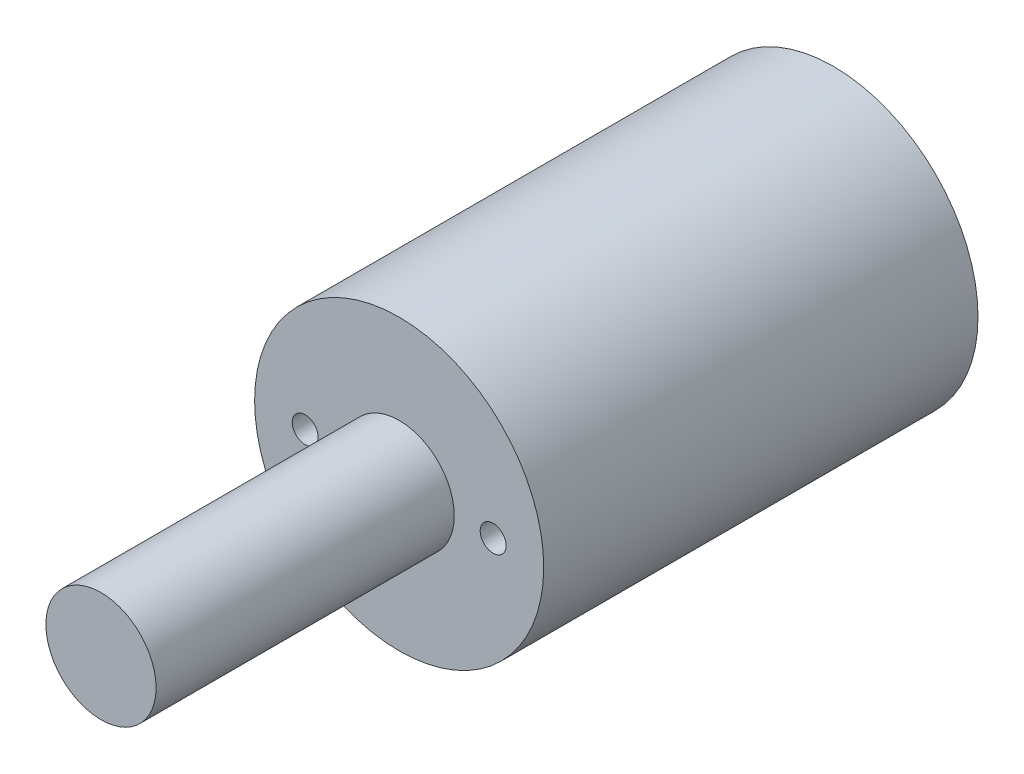
ISO-10303-21;
HEADER;
FILE_DESCRIPTION(('STEP AP214'),'2;1');
FILE_NAME('part.step','',(''),(''),'','','');
FILE_SCHEMA(('AUTOMOTIVE_DESIGN { 1 0 10303 214 1 1 1 1 }'));
ENDSEC;
DATA;
#1=APPLICATION_CONTEXT('core data for automotive mechanical design processes');
#2=APPLICATION_PROTOCOL_DEFINITION('international standard','automotive_design',2000,#1);
#3=PRODUCT_CONTEXT('',#1,'mechanical');
#4=PRODUCT('Part','Part','',(#3));
#5=PRODUCT_RELATED_PRODUCT_CATEGORY('part','',(#4));
#6=PRODUCT_DEFINITION_FORMATION('','',#4);
#7=PRODUCT_DEFINITION_CONTEXT('part definition',#1,'design');
#8=PRODUCT_DEFINITION('design','',#6,#7);
#9=PRODUCT_DEFINITION_SHAPE('','',#8);
#10=(LENGTH_UNIT() NAMED_UNIT(*) SI_UNIT(.MILLI.,.METRE.));
#11=(NAMED_UNIT(*) PLANE_ANGLE_UNIT() SI_UNIT($,.RADIAN.));
#12=(NAMED_UNIT(*) SI_UNIT($,.STERADIAN.) SOLID_ANGLE_UNIT());
#13=UNCERTAINTY_MEASURE_WITH_UNIT(LENGTH_MEASURE(1.E-05),#10,'distance_accuracy_value','');
#14=(GEOMETRIC_REPRESENTATION_CONTEXT(3) GLOBAL_UNCERTAINTY_ASSIGNED_CONTEXT((#13)) GLOBAL_UNIT_ASSIGNED_CONTEXT((#10,
#11,#12)) REPRESENTATION_CONTEXT('',''));
#15=CARTESIAN_POINT('',(0.,0.,0.));
#16=DIRECTION('',(0.,0.,1.));
#17=DIRECTION('',(1.,0.,0.));
#18=AXIS2_PLACEMENT_3D('',#15,#16,#17);
#19=CARTESIAN_POINT('',(0.,0.,67.));
#20=DIRECTION('',(0.,0.,-1.));
#21=DIRECTION('',(-1.,0.,0.));
#22=AXIS2_PLACEMENT_3D('',#19,#20,#21);
#23=CYLINDRICAL_SURFACE('',#22,22.3);
#24=CARTESIAN_POINT('',(0.,0.,67.));
#25=DIRECTION('',(0.,0.,1.));
#26=DIRECTION('',(1.,0.,0.));
#27=AXIS2_PLACEMENT_3D('',#24,#25,#26);
#28=CIRCLE('',#27,22.3);
#29=CARTESIAN_POINT('',(22.3,0.,67.));
#30=VERTEX_POINT('',#29);
#31=EDGE_CURVE('E37',#30,#30,#28,.T.);
#32=ORIENTED_EDGE('',*,*,#31,.F.);
#33=EDGE_LOOP('',(#32));
#34=FACE_BOUND('',#33,.T.);
#35=CARTESIAN_POINT('',(0.,0.,0.));
#36=DIRECTION('',(0.,0.,1.));
#37=DIRECTION('',(1.,0.,0.));
#38=AXIS2_PLACEMENT_3D('',#35,#36,#37);
#39=CIRCLE('',#38,22.3);
#40=CARTESIAN_POINT('',(22.3,0.,0.));
#41=VERTEX_POINT('',#40);
#42=EDGE_CURVE('E41',#41,#41,#39,.T.);
#43=ORIENTED_EDGE('',*,*,#42,.T.);
#44=EDGE_LOOP('',(#43));
#45=FACE_BOUND('',#44,.T.);
#46=ADVANCED_FACE('F31',(#34,#45),#23,.T.);
#47=CARTESIAN_POINT('',(0.,0.,67.));
#48=DIRECTION('',(0.,0.,1.));
#49=DIRECTION('',(1.,0.,0.));
#50=AXIS2_PLACEMENT_3D('',#47,#48,#49);
#51=PLANE('',#50);
#52=CARTESIAN_POINT('',(-14.5,0.,67.));
#53=DIRECTION('',(0.,0.,1.));
#54=DIRECTION('',(-1.,0.,0.));
#55=AXIS2_PLACEMENT_3D('',#52,#53,#54);
#56=CIRCLE('',#55,2.);
#57=CARTESIAN_POINT('',(-16.5,0.,67.));
#58=VERTEX_POINT('',#57);
#59=EDGE_CURVE('E63',#58,#58,#56,.T.);
#60=ORIENTED_EDGE('',*,*,#59,.F.);
#61=EDGE_LOOP('',(#60));
#62=FACE_BOUND('',#61,.T.);
#63=CARTESIAN_POINT('',(14.5,0.,67.));
#64=DIRECTION('',(0.,0.,1.));
#65=DIRECTION('',(1.,0.,0.));
#66=AXIS2_PLACEMENT_3D('',#63,#64,#65);
#67=CIRCLE('',#66,2.);
#68=CARTESIAN_POINT('',(16.5,0.,67.));
#69=VERTEX_POINT('',#68);
#70=EDGE_CURVE('E57',#69,#69,#67,.T.);
#71=ORIENTED_EDGE('',*,*,#70,.F.);
#72=EDGE_LOOP('',(#71));
#73=FACE_BOUND('',#72,.T.);
#74=CARTESIAN_POINT('',(0.,0.,67.));
#75=DIRECTION('',(0.,0.,1.));
#76=DIRECTION('',(1.,0.,0.));
#77=AXIS2_PLACEMENT_3D('',#74,#75,#76);
#78=CIRCLE('',#77,8.5);
#79=CARTESIAN_POINT('',(8.5,0.,67.));
#80=VERTEX_POINT('',#79);
#81=EDGE_CURVE('E48',#80,#80,#78,.T.);
#82=ORIENTED_EDGE('',*,*,#81,.F.);
#83=EDGE_LOOP('',(#82));
#84=FACE_BOUND('',#83,.T.);
#85=ORIENTED_EDGE('',*,*,#31,.T.);
#86=EDGE_LOOP('',(#85));
#87=FACE_BOUND('',#86,.T.);
#88=ADVANCED_FACE('F78',(#62,#73,#84,#87),#51,.T.);
#89=CARTESIAN_POINT('',(0.,0.,0.));
#90=DIRECTION('',(0.,0.,1.));
#91=DIRECTION('',(1.,0.,0.));
#92=AXIS2_PLACEMENT_3D('',#89,#90,#91);
#93=PLANE('',#92);
#94=CARTESIAN_POINT('',(0.,0.,0.));
#95=DIRECTION('',(0.,0.,1.));
#96=DIRECTION('',(1.,0.,0.));
#97=AXIS2_PLACEMENT_3D('',#94,#95,#96);
#98=CIRCLE('',#97,2.5);
#99=CARTESIAN_POINT('',(2.5,0.,0.));
#100=VERTEX_POINT('',#99);
#101=EDGE_CURVE('E10',#100,#100,#98,.F.);
#102=ORIENTED_EDGE('',*,*,#101,.F.);
#103=EDGE_LOOP('',(#102));
#104=FACE_BOUND('',#103,.T.);
#105=ORIENTED_EDGE('',*,*,#42,.F.);
#106=EDGE_LOOP('',(#105));
#107=FACE_BOUND('',#106,.T.);
#108=ADVANCED_FACE('F81',(#104,#107),#93,.F.);
#109=CARTESIAN_POINT('',(0.,0.,113.));
#110=DIRECTION('',(0.,0.,-1.));
#111=DIRECTION('',(-1.,0.,0.));
#112=AXIS2_PLACEMENT_3D('',#109,#110,#111);
#113=CYLINDRICAL_SURFACE('',#112,8.5);
#114=CARTESIAN_POINT('',(0.,0.,113.));
#115=DIRECTION('',(0.,0.,1.));
#116=DIRECTION('',(1.,0.,0.));
#117=AXIS2_PLACEMENT_3D('',#114,#115,#116);
#118=CIRCLE('',#117,8.5);
#119=CARTESIAN_POINT('',(8.5,0.,113.));
#120=VERTEX_POINT('',#119);
#121=EDGE_CURVE('E46',#120,#120,#118,.T.);
#122=ORIENTED_EDGE('',*,*,#121,.F.);
#123=EDGE_LOOP('',(#122));
#124=FACE_BOUND('',#123,.T.);
#125=ORIENTED_EDGE('',*,*,#81,.T.);
#126=EDGE_LOOP('',(#125));
#127=FACE_BOUND('',#126,.T.);
#128=ADVANCED_FACE('F87',(#124,#127),#113,.T.);
#129=CARTESIAN_POINT('',(0.,0.,113.));
#130=DIRECTION('',(0.,0.,1.));
#131=DIRECTION('',(1.,0.,0.));
#132=AXIS2_PLACEMENT_3D('',#129,#130,#131);
#133=PLANE('',#132);
#134=ORIENTED_EDGE('',*,*,#121,.T.);
#135=EDGE_LOOP('',(#134));
#136=FACE_BOUND('',#135,.T.);
#137=ADVANCED_FACE('F89',(#136),#133,.T.);
#138=CARTESIAN_POINT('',(0.,0.,-7.));
#139=DIRECTION('',(0.,0.,1.));
#140=DIRECTION('',(1.,0.,0.));
#141=AXIS2_PLACEMENT_3D('',#138,#139,#140);
#142=CYLINDRICAL_SURFACE('',#141,2.5);
#143=CARTESIAN_POINT('',(0.,0.,-7.));
#144=DIRECTION('',(0.,0.,-1.));
#145=DIRECTION('',(-1.,0.,0.));
#146=AXIS2_PLACEMENT_3D('',#143,#144,#145);
#147=CIRCLE('',#146,2.5);
#148=CARTESIAN_POINT('',(-2.5,0.,-7.));
#149=VERTEX_POINT('',#148);
#150=EDGE_CURVE('E51',#149,#149,#147,.T.);
#151=ORIENTED_EDGE('',*,*,#150,.F.);
#152=EDGE_LOOP('',(#151));
#153=FACE_BOUND('',#152,.T.);
#154=ORIENTED_EDGE('',*,*,#101,.T.);
#155=EDGE_LOOP('',(#154));
#156=FACE_BOUND('',#155,.T.);
#157=ADVANCED_FACE('F96',(#153,#156),#142,.T.);
#158=CARTESIAN_POINT('',(0.,0.,-7.));
#159=DIRECTION('',(0.,0.,-1.));
#160=DIRECTION('',(-1.,0.,0.));
#161=AXIS2_PLACEMENT_3D('',#158,#159,#160);
#162=PLANE('',#161);
#163=ORIENTED_EDGE('',*,*,#150,.T.);
#164=EDGE_LOOP('',(#163));
#165=FACE_BOUND('',#164,.T.);
#166=ADVANCED_FACE('F132',(#165),#162,.T.);
#167=CARTESIAN_POINT('',(14.5,0.,57.));
#168=DIRECTION('',(0.,0.,1.));
#169=DIRECTION('',(1.,0.,0.));
#170=AXIS2_PLACEMENT_3D('',#167,#168,#169);
#171=CYLINDRICAL_SURFACE('',#170,2.);
#172=CARTESIAN_POINT('',(14.5,0.,57.));
#173=DIRECTION('',(0.,0.,1.));
#174=DIRECTION('',(1.,0.,0.));
#175=AXIS2_PLACEMENT_3D('',#172,#173,#174);
#176=CIRCLE('',#175,2.);
#177=CARTESIAN_POINT('',(16.5,0.,57.));
#178=VERTEX_POINT('',#177);
#179=EDGE_CURVE('E56',#178,#178,#176,.T.);
#180=ORIENTED_EDGE('',*,*,#179,.F.);
#181=EDGE_LOOP('',(#180));
#182=FACE_BOUND('',#181,.T.);
#183=ORIENTED_EDGE('',*,*,#70,.T.);
#184=EDGE_LOOP('',(#183));
#185=FACE_BOUND('',#184,.T.);
#186=ADVANCED_FACE('F141',(#182,#185),#171,.F.);
#187=CARTESIAN_POINT('',(14.5,0.,57.));
#188=DIRECTION('',(0.,0.,1.));
#189=DIRECTION('',(1.,0.,0.));
#190=AXIS2_PLACEMENT_3D('',#187,#188,#189);
#191=PLANE('',#190);
#192=ORIENTED_EDGE('',*,*,#179,.T.);
#193=EDGE_LOOP('',(#192));
#194=FACE_BOUND('',#193,.T.);
#195=ADVANCED_FACE('F74',(#194),#191,.T.);
#196=CARTESIAN_POINT('',(-14.5,0.,57.));
#197=DIRECTION('',(0.,0.,1.));
#198=DIRECTION('',(1.,0.,0.));
#199=AXIS2_PLACEMENT_3D('',#196,#197,#198);
#200=CYLINDRICAL_SURFACE('',#199,2.);
#201=CARTESIAN_POINT('',(-14.5,0.,57.));
#202=DIRECTION('',(0.,0.,1.));
#203=DIRECTION('',(-1.,0.,0.));
#204=AXIS2_PLACEMENT_3D('',#201,#202,#203);
#205=CIRCLE('',#204,2.);
#206=CARTESIAN_POINT('',(-16.5,0.,57.));
#207=VERTEX_POINT('',#206);
#208=EDGE_CURVE('E60',#207,#207,#205,.T.);
#209=ORIENTED_EDGE('',*,*,#208,.F.);
#210=EDGE_LOOP('',(#209));
#211=FACE_BOUND('',#210,.T.);
#212=ORIENTED_EDGE('',*,*,#59,.T.);
#213=EDGE_LOOP('',(#212));
#214=FACE_BOUND('',#213,.T.);
#215=ADVANCED_FACE('F71',(#211,#214),#200,.F.);
#216=CARTESIAN_POINT('',(-14.5,0.,57.));
#217=DIRECTION('',(0.,0.,-1.));
#218=DIRECTION('',(-1.,0.,0.));
#219=AXIS2_PLACEMENT_3D('',#216,#217,#218);
#220=PLANE('',#219);
#221=ORIENTED_EDGE('',*,*,#208,.T.);
#222=EDGE_LOOP('',(#221));
#223=FACE_BOUND('',#222,.T.);
#224=ADVANCED_FACE('F69',(#223),#220,.F.);
#225=CLOSED_SHELL('',(#46,#88,#108,#128,#137,#157,#166,#186,#195,#215,#224));
#226=MANIFOLD_SOLID_BREP('B2',#225);
#227=ADVANCED_BREP_SHAPE_REPRESENTATION('',(#18,#226),#14);
#228=SHAPE_DEFINITION_REPRESENTATION(#9,#227);
ENDSEC;
END-ISO-10303-21;
